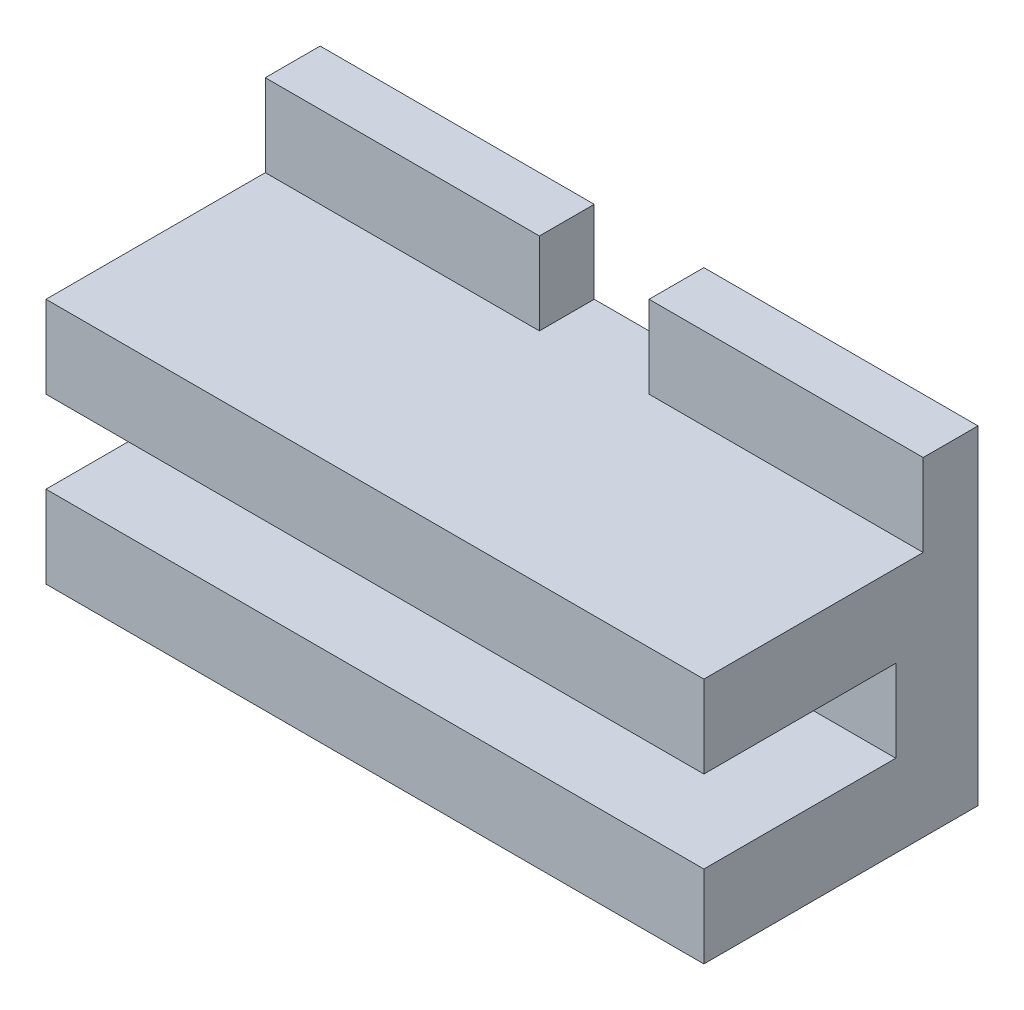
ISO-10303-21;
HEADER;
FILE_DESCRIPTION(('STEP AP214'),'2;1');
FILE_NAME('part.step','',(''),(''),'','','');
FILE_SCHEMA(('AUTOMOTIVE_DESIGN { 1 0 10303 214 1 1 1 1 }'));
ENDSEC;
DATA;
#1=APPLICATION_CONTEXT('core data for automotive mechanical design processes');
#2=APPLICATION_PROTOCOL_DEFINITION('international standard','automotive_design',2000,#1);
#3=PRODUCT_CONTEXT('',#1,'mechanical');
#4=PRODUCT('Part','Part','',(#3));
#5=PRODUCT_RELATED_PRODUCT_CATEGORY('part','',(#4));
#6=PRODUCT_DEFINITION_FORMATION('','',#4);
#7=PRODUCT_DEFINITION_CONTEXT('part definition',#1,'design');
#8=PRODUCT_DEFINITION('design','',#6,#7);
#9=PRODUCT_DEFINITION_SHAPE('','',#8);
#10=(LENGTH_UNIT() NAMED_UNIT(*) SI_UNIT(.MILLI.,.METRE.));
#11=(NAMED_UNIT(*) PLANE_ANGLE_UNIT() SI_UNIT($,.RADIAN.));
#12=(NAMED_UNIT(*) SI_UNIT($,.STERADIAN.) SOLID_ANGLE_UNIT());
#13=UNCERTAINTY_MEASURE_WITH_UNIT(LENGTH_MEASURE(1.E-05),#10,'distance_accuracy_value','');
#14=(GEOMETRIC_REPRESENTATION_CONTEXT(3) GLOBAL_UNCERTAINTY_ASSIGNED_CONTEXT((#13)) GLOBAL_UNIT_ASSIGNED_CONTEXT((#10,
#11,#12)) REPRESENTATION_CONTEXT('',''));
#15=CARTESIAN_POINT('',(0.,0.,0.));
#16=DIRECTION('',(0.,0.,1.));
#17=DIRECTION('',(1.,0.,0.));
#18=AXIS2_PLACEMENT_3D('',#15,#16,#17);
#19=CARTESIAN_POINT('',(0.,4.5,0.));
#20=DIRECTION('',(0.,1.,0.));
#21=DIRECTION('',(0.,0.,1.));
#22=AXIS2_PLACEMENT_3D('',#19,#20,#21);
#23=PLANE('',#22);
#24=DIRECTION('',(0.,0.,-1.));
#25=VECTOR('',#24,1.);
#26=CARTESIAN_POINT('',(12.,4.5,0.));
#27=LINE('',#26,#25);
#28=CARTESIAN_POINT('',(12.,4.5,5.));
#29=VERTEX_POINT('',#28);
#30=CARTESIAN_POINT('',(12.,4.5,1.));
#31=VERTEX_POINT('',#30);
#32=EDGE_CURVE('E223',#29,#31,#27,.T.);
#33=ORIENTED_EDGE('',*,*,#32,.T.);
#34=DIRECTION('',(1.,0.,0.));
#35=VECTOR('',#34,1.);
#36=CARTESIAN_POINT('',(7.,4.5,1.));
#37=LINE('',#36,#35);
#38=CARTESIAN_POINT('',(7.,4.5,1.));
#39=VERTEX_POINT('',#38);
#40=EDGE_CURVE('E161',#39,#31,#37,.T.);
#41=ORIENTED_EDGE('',*,*,#40,.F.);
#42=DIRECTION('',(0.,0.,1.));
#43=VECTOR('',#42,1.);
#44=CARTESIAN_POINT('',(7.,4.5,0.));
#45=LINE('',#44,#43);
#46=CARTESIAN_POINT('',(7.,4.5,0.));
#47=VERTEX_POINT('',#46);
#48=EDGE_CURVE('E157',#47,#39,#45,.T.);
#49=ORIENTED_EDGE('',*,*,#48,.F.);
#50=DIRECTION('',(-1.,0.,0.));
#51=VECTOR('',#50,1.);
#52=CARTESIAN_POINT('',(0.,4.5,0.));
#53=LINE('',#52,#51);
#54=CARTESIAN_POINT('',(5.,4.5,0.));
#55=VERTEX_POINT('',#54);
#56=EDGE_CURVE('E37',#47,#55,#53,.T.);
#57=ORIENTED_EDGE('',*,*,#56,.T.);
#58=DIRECTION('',(0.,0.,-1.));
#59=VECTOR('',#58,1.);
#60=CARTESIAN_POINT('',(5.,4.5,0.));
#61=LINE('',#60,#59);
#62=CARTESIAN_POINT('',(5.,4.5,1.));
#63=VERTEX_POINT('',#62);
#64=EDGE_CURVE('E166',#63,#55,#61,.T.);
#65=ORIENTED_EDGE('',*,*,#64,.F.);
#66=DIRECTION('',(1.,0.,0.));
#67=VECTOR('',#66,1.);
#68=CARTESIAN_POINT('',(0.,4.5,1.));
#69=LINE('',#68,#67);
#70=CARTESIAN_POINT('',(0.,4.5,1.));
#71=VERTEX_POINT('',#70);
#72=EDGE_CURVE('E163',#71,#63,#69,.T.);
#73=ORIENTED_EDGE('',*,*,#72,.F.);
#74=DIRECTION('',(0.,0.,1.));
#75=VECTOR('',#74,1.);
#76=CARTESIAN_POINT('',(0.,4.5,0.));
#77=LINE('',#76,#75);
#78=CARTESIAN_POINT('',(0.,4.5,5.));
#79=VERTEX_POINT('',#78);
#80=EDGE_CURVE('E212',#71,#79,#77,.T.);
#81=ORIENTED_EDGE('',*,*,#80,.T.);
#82=DIRECTION('',(1.,0.,0.));
#83=VECTOR('',#82,1.);
#84=CARTESIAN_POINT('',(0.,4.5,5.));
#85=LINE('',#84,#83);
#86=EDGE_CURVE('E214',#79,#29,#85,.T.);
#87=ORIENTED_EDGE('',*,*,#86,.T.);
#88=EDGE_LOOP('',(#33,#41,#49,#57,#65,#73,#81,#87));
#89=FACE_BOUND('',#88,.T.);
#90=ADVANCED_FACE('F33',(#89),#23,.T.);
#91=CARTESIAN_POINT('',(0.,4.5,0.));
#92=DIRECTION('',(1.,0.,0.));
#93=DIRECTION('',(0.,0.,-1.));
#94=AXIS2_PLACEMENT_3D('',#91,#92,#93);
#95=PLANE('',#94);
#96=DIRECTION('',(0.,0.,1.));
#97=VECTOR('',#96,1.);
#98=CARTESIAN_POINT('',(0.,1.5,1.5));
#99=LINE('',#98,#97);
#100=CARTESIAN_POINT('',(0.,1.5,1.5));
#101=VERTEX_POINT('',#100);
#102=CARTESIAN_POINT('',(0.,1.5,5.));
#103=VERTEX_POINT('',#102);
#104=EDGE_CURVE('E377',#101,#103,#99,.T.);
#105=ORIENTED_EDGE('',*,*,#104,.F.);
#106=DIRECTION('',(0.,1.,0.));
#107=VECTOR('',#106,1.);
#108=CARTESIAN_POINT('',(0.,1.5,1.5));
#109=LINE('',#108,#107);
#110=CARTESIAN_POINT('',(0.,3.,1.5));
#111=VERTEX_POINT('',#110);
#112=EDGE_CURVE('E230',#101,#111,#109,.T.);
#113=ORIENTED_EDGE('',*,*,#112,.T.);
#114=DIRECTION('',(0.,0.,1.));
#115=VECTOR('',#114,1.);
#116=CARTESIAN_POINT('',(0.,3.,1.5));
#117=LINE('',#116,#115);
#118=CARTESIAN_POINT('',(0.,3.,5.));
#119=VERTEX_POINT('',#118);
#120=EDGE_CURVE('E203',#111,#119,#117,.T.);
#121=ORIENTED_EDGE('',*,*,#120,.T.);
#122=DIRECTION('',(0.,-1.,0.));
#123=VECTOR('',#122,1.);
#124=CARTESIAN_POINT('',(0.,4.5,5.));
#125=LINE('',#124,#123);
#126=EDGE_CURVE('E11',#79,#119,#125,.T.);
#127=ORIENTED_EDGE('',*,*,#126,.F.);
#128=ORIENTED_EDGE('',*,*,#80,.F.);
#129=DIRECTION('',(0.,-1.,0.));
#130=VECTOR('',#129,1.);
#131=CARTESIAN_POINT('',(0.,6.,1.));
#132=LINE('',#131,#130);
#133=CARTESIAN_POINT('',(0.,6.,1.));
#134=VERTEX_POINT('',#133);
#135=EDGE_CURVE('E198',#134,#71,#132,.T.);
#136=ORIENTED_EDGE('',*,*,#135,.F.);
#137=DIRECTION('',(0.,0.,1.));
#138=VECTOR('',#137,1.);
#139=CARTESIAN_POINT('',(0.,6.,0.));
#140=LINE('',#139,#138);
#141=CARTESIAN_POINT('',(0.,6.,0.));
#142=VERTEX_POINT('',#141);
#143=EDGE_CURVE('E172',#142,#134,#140,.T.);
#144=ORIENTED_EDGE('',*,*,#143,.F.);
#145=DIRECTION('',(0.,-1.,0.));
#146=VECTOR('',#145,1.);
#147=CARTESIAN_POINT('',(0.,4.5,0.));
#148=LINE('',#147,#146);
#149=CARTESIAN_POINT('',(0.,0.,0.));
#150=VERTEX_POINT('',#149);
#151=EDGE_CURVE('E236',#142,#150,#148,.T.);
#152=ORIENTED_EDGE('',*,*,#151,.T.);
#153=DIRECTION('',(0.,0.,1.));
#154=VECTOR('',#153,1.);
#155=CARTESIAN_POINT('',(0.,0.,0.));
#156=LINE('',#155,#154);
#157=CARTESIAN_POINT('',(0.,0.,5.));
#158=VERTEX_POINT('',#157);
#159=EDGE_CURVE('E226',#150,#158,#156,.T.);
#160=ORIENTED_EDGE('',*,*,#159,.T.);
#161=EDGE_CURVE('E43',#103,#158,#125,.T.);
#162=ORIENTED_EDGE('',*,*,#161,.F.);
#163=EDGE_LOOP('',(#105,#113,#121,#127,#128,#136,#144,#152,#160,#162));
#164=FACE_BOUND('',#163,.T.);
#165=ADVANCED_FACE('F35',(#164),#95,.F.);
#166=CARTESIAN_POINT('',(0.,4.5,5.));
#167=DIRECTION('',(0.,0.,-1.));
#168=DIRECTION('',(-1.,0.,0.));
#169=AXIS2_PLACEMENT_3D('',#166,#167,#168);
#170=PLANE('',#169);
#171=DIRECTION('',(1.,0.,0.));
#172=VECTOR('',#171,1.);
#173=CARTESIAN_POINT('',(0.,1.5,5.));
#174=LINE('',#173,#172);
#175=CARTESIAN_POINT('',(12.,1.5,5.));
#176=VERTEX_POINT('',#175);
#177=EDGE_CURVE('E385',#103,#176,#174,.T.);
#178=ORIENTED_EDGE('',*,*,#177,.F.);
#179=ORIENTED_EDGE('',*,*,#161,.T.);
#180=DIRECTION('',(1.,0.,0.));
#181=VECTOR('',#180,1.);
#182=CARTESIAN_POINT('',(0.,0.,5.));
#183=LINE('',#182,#181);
#184=CARTESIAN_POINT('',(12.,0.,5.));
#185=VERTEX_POINT('',#184);
#186=EDGE_CURVE('E229',#158,#185,#183,.T.);
#187=ORIENTED_EDGE('',*,*,#186,.T.);
#188=DIRECTION('',(0.,-1.,0.));
#189=VECTOR('',#188,1.);
#190=CARTESIAN_POINT('',(12.,4.5,5.));
#191=LINE('',#190,#189);
#192=EDGE_CURVE('E239',#176,#185,#191,.T.);
#193=ORIENTED_EDGE('',*,*,#192,.F.);
#194=EDGE_LOOP('',(#178,#179,#187,#193));
#195=FACE_BOUND('',#194,.T.);
#196=ADVANCED_FACE('F251',(#195),#170,.F.);
#197=CARTESIAN_POINT('',(12.,4.5,0.));
#198=DIRECTION('',(-1.,0.,0.));
#199=DIRECTION('',(0.,0.,1.));
#200=AXIS2_PLACEMENT_3D('',#197,#198,#199);
#201=PLANE('',#200);
#202=DIRECTION('',(0.,0.,-1.));
#203=VECTOR('',#202,1.);
#204=CARTESIAN_POINT('',(12.,1.5,1.5));
#205=LINE('',#204,#203);
#206=CARTESIAN_POINT('',(12.,1.5,1.5));
#207=VERTEX_POINT('',#206);
#208=EDGE_CURVE('E247',#176,#207,#205,.T.);
#209=ORIENTED_EDGE('',*,*,#208,.F.);
#210=ORIENTED_EDGE('',*,*,#192,.T.);
#211=DIRECTION('',(0.,0.,-1.));
#212=VECTOR('',#211,1.);
#213=CARTESIAN_POINT('',(12.,0.,0.));
#214=LINE('',#213,#212);
#215=CARTESIAN_POINT('',(12.,0.,0.));
#216=VERTEX_POINT('',#215);
#217=EDGE_CURVE('E233',#185,#216,#214,.T.);
#218=ORIENTED_EDGE('',*,*,#217,.T.);
#219=DIRECTION('',(0.,-1.,0.));
#220=VECTOR('',#219,1.);
#221=CARTESIAN_POINT('',(12.,4.5,0.));
#222=LINE('',#221,#220);
#223=CARTESIAN_POINT('',(12.,6.,0.));
#224=VERTEX_POINT('',#223);
#225=EDGE_CURVE('E145',#224,#216,#222,.T.);
#226=ORIENTED_EDGE('',*,*,#225,.F.);
#227=DIRECTION('',(0.,0.,-1.));
#228=VECTOR('',#227,1.);
#229=CARTESIAN_POINT('',(12.,6.,0.));
#230=LINE('',#229,#228);
#231=CARTESIAN_POINT('',(12.,6.,1.));
#232=VERTEX_POINT('',#231);
#233=EDGE_CURVE('E136',#232,#224,#230,.T.);
#234=ORIENTED_EDGE('',*,*,#233,.F.);
#235=DIRECTION('',(0.,-1.,0.));
#236=VECTOR('',#235,1.);
#237=CARTESIAN_POINT('',(12.,6.,1.));
#238=LINE('',#237,#236);
#239=EDGE_CURVE('E142',#232,#31,#238,.T.);
#240=ORIENTED_EDGE('',*,*,#239,.T.);
#241=ORIENTED_EDGE('',*,*,#32,.F.);
#242=CARTESIAN_POINT('',(12.,3.,5.));
#243=VERTEX_POINT('',#242);
#244=EDGE_CURVE('E240',#29,#243,#191,.T.);
#245=ORIENTED_EDGE('',*,*,#244,.T.);
#246=DIRECTION('',(0.,0.,-1.));
#247=VECTOR('',#246,1.);
#248=CARTESIAN_POINT('',(12.,3.,1.5));
#249=LINE('',#248,#247);
#250=CARTESIAN_POINT('',(12.,3.,1.5));
#251=VERTEX_POINT('',#250);
#252=EDGE_CURVE('E370',#243,#251,#249,.T.);
#253=ORIENTED_EDGE('',*,*,#252,.T.);
#254=DIRECTION('',(0.,1.,0.));
#255=VECTOR('',#254,1.);
#256=CARTESIAN_POINT('',(12.,1.5,1.5));
#257=LINE('',#256,#255);
#258=EDGE_CURVE('E220',#207,#251,#257,.T.);
#259=ORIENTED_EDGE('',*,*,#258,.F.);
#260=EDGE_LOOP('',(#209,#210,#218,#226,#234,#240,#241,#245,#253,#259));
#261=FACE_BOUND('',#260,.T.);
#262=ADVANCED_FACE('F139',(#261),#201,.F.);
#263=ORIENTED_EDGE('',*,*,#126,.T.);
#264=DIRECTION('',(1.,0.,0.));
#265=VECTOR('',#264,1.);
#266=CARTESIAN_POINT('',(0.,3.,5.));
#267=LINE('',#266,#265);
#268=EDGE_CURVE('E207',#119,#243,#267,.T.);
#269=ORIENTED_EDGE('',*,*,#268,.T.);
#270=ORIENTED_EDGE('',*,*,#244,.F.);
#271=ORIENTED_EDGE('',*,*,#86,.F.);
#272=EDGE_LOOP('',(#263,#269,#270,#271));
#273=FACE_BOUND('',#272,.T.);
#274=ADVANCED_FACE('F290',(#273),#170,.F.);
#275=CARTESIAN_POINT('',(0.,4.5,0.));
#276=DIRECTION('',(0.,0.,1.));
#277=DIRECTION('',(1.,0.,0.));
#278=AXIS2_PLACEMENT_3D('',#275,#276,#277);
#279=PLANE('',#278);
#280=DIRECTION('',(-1.,0.,0.));
#281=VECTOR('',#280,1.);
#282=CARTESIAN_POINT('',(0.,0.,0.));
#283=LINE('',#282,#281);
#284=EDGE_CURVE('E215',#216,#150,#283,.T.);
#285=ORIENTED_EDGE('',*,*,#284,.T.);
#286=ORIENTED_EDGE('',*,*,#151,.F.);
#287=DIRECTION('',(-1.,0.,0.));
#288=VECTOR('',#287,1.);
#289=CARTESIAN_POINT('',(0.,6.,0.));
#290=LINE('',#289,#288);
#291=CARTESIAN_POINT('',(5.,6.,0.));
#292=VERTEX_POINT('',#291);
#293=EDGE_CURVE('E179',#292,#142,#290,.T.);
#294=ORIENTED_EDGE('',*,*,#293,.F.);
#295=DIRECTION('',(0.,-1.,0.));
#296=VECTOR('',#295,1.);
#297=CARTESIAN_POINT('',(5.,6.,0.));
#298=LINE('',#297,#296);
#299=EDGE_CURVE('E182',#292,#55,#298,.T.);
#300=ORIENTED_EDGE('',*,*,#299,.T.);
#301=ORIENTED_EDGE('',*,*,#56,.F.);
#302=DIRECTION('',(0.,-1.,0.));
#303=VECTOR('',#302,1.);
#304=CARTESIAN_POINT('',(7.,6.,0.));
#305=LINE('',#304,#303);
#306=CARTESIAN_POINT('',(7.,6.,0.));
#307=VERTEX_POINT('',#306);
#308=EDGE_CURVE('E51',#307,#47,#305,.T.);
#309=ORIENTED_EDGE('',*,*,#308,.F.);
#310=DIRECTION('',(-1.,0.,0.));
#311=VECTOR('',#310,1.);
#312=CARTESIAN_POINT('',(7.,6.,0.));
#313=LINE('',#312,#311);
#314=EDGE_CURVE('E148',#224,#307,#313,.T.);
#315=ORIENTED_EDGE('',*,*,#314,.F.);
#316=ORIENTED_EDGE('',*,*,#225,.T.);
#317=EDGE_LOOP('',(#285,#286,#294,#300,#301,#309,#315,#316));
#318=FACE_BOUND('',#317,.T.);
#319=ADVANCED_FACE('F257',(#318),#279,.F.);
#320=CARTESIAN_POINT('',(0.,0.,0.));
#321=DIRECTION('',(0.,1.,0.));
#322=DIRECTION('',(0.,0.,1.));
#323=AXIS2_PLACEMENT_3D('',#320,#321,#322);
#324=PLANE('',#323);
#325=ORIENTED_EDGE('',*,*,#159,.F.);
#326=ORIENTED_EDGE('',*,*,#284,.F.);
#327=ORIENTED_EDGE('',*,*,#217,.F.);
#328=ORIENTED_EDGE('',*,*,#186,.F.);
#329=EDGE_LOOP('',(#325,#326,#327,#328));
#330=FACE_BOUND('',#329,.T.);
#331=ADVANCED_FACE('F256',(#330),#324,.F.);
#332=CARTESIAN_POINT('',(0.,1.5,1.5));
#333=DIRECTION('',(0.,0.,-1.));
#334=DIRECTION('',(-1.,0.,0.));
#335=AXIS2_PLACEMENT_3D('',#332,#333,#334);
#336=PLANE('',#335);
#337=DIRECTION('',(-1.,0.,0.));
#338=VECTOR('',#337,1.);
#339=CARTESIAN_POINT('',(0.,3.,1.5));
#340=LINE('',#339,#338);
#341=EDGE_CURVE('E372',#251,#111,#340,.T.);
#342=ORIENTED_EDGE('',*,*,#341,.T.);
#343=ORIENTED_EDGE('',*,*,#112,.F.);
#344=DIRECTION('',(-1.,0.,0.));
#345=VECTOR('',#344,1.);
#346=CARTESIAN_POINT('',(0.,1.5,1.5));
#347=LINE('',#346,#345);
#348=EDGE_CURVE('E380',#207,#101,#347,.T.);
#349=ORIENTED_EDGE('',*,*,#348,.F.);
#350=ORIENTED_EDGE('',*,*,#258,.T.);
#351=EDGE_LOOP('',(#342,#343,#349,#350));
#352=FACE_BOUND('',#351,.T.);
#353=ADVANCED_FACE('F285',(#352),#336,.F.);
#354=CARTESIAN_POINT('',(0.,1.5,0.));
#355=DIRECTION('',(0.,1.,0.));
#356=DIRECTION('',(0.,0.,1.));
#357=AXIS2_PLACEMENT_3D('',#354,#355,#356);
#358=PLANE('',#357);
#359=ORIENTED_EDGE('',*,*,#104,.T.);
#360=ORIENTED_EDGE('',*,*,#177,.T.);
#361=ORIENTED_EDGE('',*,*,#208,.T.);
#362=ORIENTED_EDGE('',*,*,#348,.T.);
#363=EDGE_LOOP('',(#359,#360,#361,#362));
#364=FACE_BOUND('',#363,.T.);
#365=ADVANCED_FACE('F274',(#364),#358,.T.);
#366=CARTESIAN_POINT('',(0.,3.,0.));
#367=DIRECTION('',(0.,1.,0.));
#368=DIRECTION('',(0.,0.,1.));
#369=AXIS2_PLACEMENT_3D('',#366,#367,#368);
#370=PLANE('',#369);
#371=ORIENTED_EDGE('',*,*,#120,.F.);
#372=ORIENTED_EDGE('',*,*,#341,.F.);
#373=ORIENTED_EDGE('',*,*,#252,.F.);
#374=ORIENTED_EDGE('',*,*,#268,.F.);
#375=EDGE_LOOP('',(#371,#372,#373,#374));
#376=FACE_BOUND('',#375,.T.);
#377=ADVANCED_FACE('F267',(#376),#370,.F.);
#378=CARTESIAN_POINT('',(0.,6.,1.));
#379=DIRECTION('',(0.,0.,-1.));
#380=DIRECTION('',(-1.,0.,0.));
#381=AXIS2_PLACEMENT_3D('',#378,#379,#380);
#382=PLANE('',#381);
#383=ORIENTED_EDGE('',*,*,#72,.T.);
#384=DIRECTION('',(0.,-1.,0.));
#385=VECTOR('',#384,1.);
#386=CARTESIAN_POINT('',(5.,6.,1.));
#387=LINE('',#386,#385);
#388=CARTESIAN_POINT('',(5.,6.,1.));
#389=VERTEX_POINT('',#388);
#390=EDGE_CURVE('E185',#389,#63,#387,.T.);
#391=ORIENTED_EDGE('',*,*,#390,.F.);
#392=DIRECTION('',(1.,0.,0.));
#393=VECTOR('',#392,1.);
#394=CARTESIAN_POINT('',(0.,6.,1.));
#395=LINE('',#394,#393);
#396=EDGE_CURVE('E175',#134,#389,#395,.T.);
#397=ORIENTED_EDGE('',*,*,#396,.F.);
#398=ORIENTED_EDGE('',*,*,#135,.T.);
#399=EDGE_LOOP('',(#383,#391,#397,#398));
#400=FACE_BOUND('',#399,.T.);
#401=ADVANCED_FACE('F265',(#400),#382,.F.);
#402=CARTESIAN_POINT('',(5.,6.,0.));
#403=DIRECTION('',(-1.,0.,0.));
#404=DIRECTION('',(0.,0.,1.));
#405=AXIS2_PLACEMENT_3D('',#402,#403,#404);
#406=PLANE('',#405);
#407=ORIENTED_EDGE('',*,*,#64,.T.);
#408=ORIENTED_EDGE('',*,*,#299,.F.);
#409=DIRECTION('',(0.,0.,-1.));
#410=VECTOR('',#409,1.);
#411=CARTESIAN_POINT('',(5.,6.,0.));
#412=LINE('',#411,#410);
#413=EDGE_CURVE('E177',#389,#292,#412,.T.);
#414=ORIENTED_EDGE('',*,*,#413,.F.);
#415=ORIENTED_EDGE('',*,*,#390,.T.);
#416=EDGE_LOOP('',(#407,#408,#414,#415));
#417=FACE_BOUND('',#416,.T.);
#418=ADVANCED_FACE('F264',(#417),#406,.F.);
#419=CARTESIAN_POINT('',(0.,6.,0.));
#420=DIRECTION('',(0.,1.,0.));
#421=DIRECTION('',(0.,0.,1.));
#422=AXIS2_PLACEMENT_3D('',#419,#420,#421);
#423=PLANE('',#422);
#424=ORIENTED_EDGE('',*,*,#143,.T.);
#425=ORIENTED_EDGE('',*,*,#396,.T.);
#426=ORIENTED_EDGE('',*,*,#413,.T.);
#427=ORIENTED_EDGE('',*,*,#293,.T.);
#428=EDGE_LOOP('',(#424,#425,#426,#427));
#429=FACE_BOUND('',#428,.T.);
#430=ADVANCED_FACE('F263',(#429),#423,.T.);
#431=CARTESIAN_POINT('',(7.,6.,1.));
#432=DIRECTION('',(0.,0.,-1.));
#433=DIRECTION('',(-1.,0.,0.));
#434=AXIS2_PLACEMENT_3D('',#431,#432,#433);
#435=PLANE('',#434);
#436=ORIENTED_EDGE('',*,*,#40,.T.);
#437=ORIENTED_EDGE('',*,*,#239,.F.);
#438=DIRECTION('',(1.,0.,0.));
#439=VECTOR('',#438,1.);
#440=CARTESIAN_POINT('',(7.,6.,1.));
#441=LINE('',#440,#439);
#442=CARTESIAN_POINT('',(7.,6.,1.));
#443=VERTEX_POINT('',#442);
#444=EDGE_CURVE('E149',#443,#232,#441,.T.);
#445=ORIENTED_EDGE('',*,*,#444,.F.);
#446=DIRECTION('',(0.,-1.,0.));
#447=VECTOR('',#446,1.);
#448=CARTESIAN_POINT('',(7.,6.,1.));
#449=LINE('',#448,#447);
#450=EDGE_CURVE('E168',#443,#39,#449,.T.);
#451=ORIENTED_EDGE('',*,*,#450,.T.);
#452=EDGE_LOOP('',(#436,#437,#445,#451));
#453=FACE_BOUND('',#452,.T.);
#454=ADVANCED_FACE('F159',(#453),#435,.F.);
#455=CARTESIAN_POINT('',(7.,6.,0.));
#456=DIRECTION('',(1.,0.,0.));
#457=DIRECTION('',(0.,0.,-1.));
#458=AXIS2_PLACEMENT_3D('',#455,#456,#457);
#459=PLANE('',#458);
#460=ORIENTED_EDGE('',*,*,#48,.T.);
#461=ORIENTED_EDGE('',*,*,#450,.F.);
#462=DIRECTION('',(0.,0.,1.));
#463=VECTOR('',#462,1.);
#464=CARTESIAN_POINT('',(7.,6.,0.));
#465=LINE('',#464,#463);
#466=EDGE_CURVE('E153',#307,#443,#465,.T.);
#467=ORIENTED_EDGE('',*,*,#466,.F.);
#468=ORIENTED_EDGE('',*,*,#308,.T.);
#469=EDGE_LOOP('',(#460,#461,#467,#468));
#470=FACE_BOUND('',#469,.T.);
#471=ADVANCED_FACE('F343',(#470),#459,.F.);
#472=CARTESIAN_POINT('',(0.,6.,0.));
#473=DIRECTION('',(0.,-1.,0.));
#474=DIRECTION('',(0.,0.,-1.));
#475=AXIS2_PLACEMENT_3D('',#472,#473,#474);
#476=PLANE('',#475);
#477=ORIENTED_EDGE('',*,*,#444,.T.);
#478=ORIENTED_EDGE('',*,*,#233,.T.);
#479=ORIENTED_EDGE('',*,*,#314,.T.);
#480=ORIENTED_EDGE('',*,*,#466,.T.);
#481=EDGE_LOOP('',(#477,#478,#479,#480));
#482=FACE_BOUND('',#481,.T.);
#483=ADVANCED_FACE('F152',(#482),#476,.F.);
#484=CLOSED_SHELL('',(#90,#165,#196,#262,#274,#319,#331,#353,#365,#377,#401,#418,#430,#454,#471,#483));
#485=MANIFOLD_SOLID_BREP('B2',#484);
#486=ADVANCED_BREP_SHAPE_REPRESENTATION('',(#18,#485),#14);
#487=SHAPE_DEFINITION_REPRESENTATION(#9,#486);
ENDSEC;
END-ISO-10303-21;
